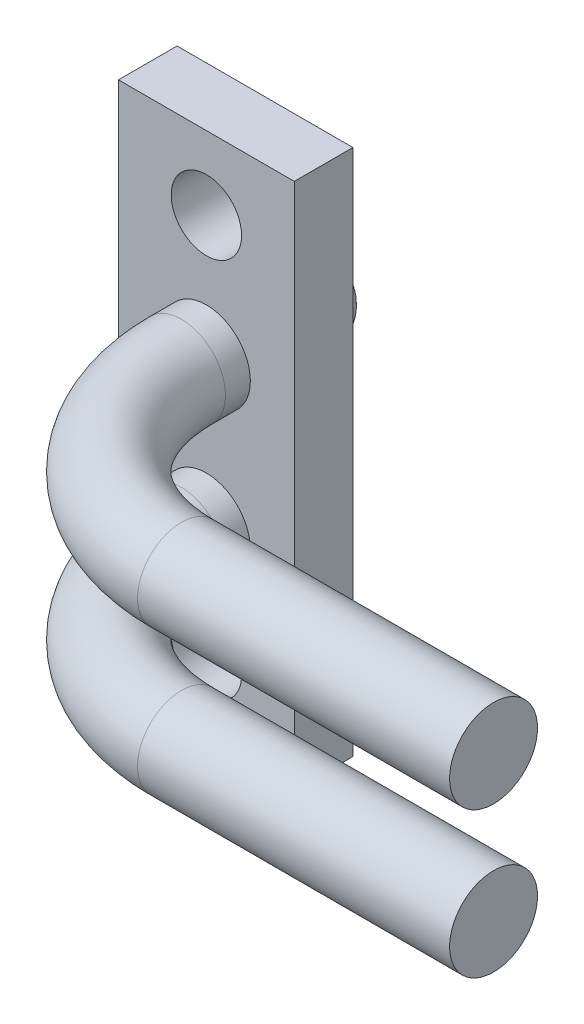
ISO-10303-21;
HEADER;
FILE_DESCRIPTION(('STEP AP214'),'2;1');
FILE_NAME('part.step','',(''),(''),'','','');
FILE_SCHEMA(('AUTOMOTIVE_DESIGN { 1 0 10303 214 1 1 1 1 }'));
ENDSEC;
DATA;
#1=APPLICATION_CONTEXT('core data for automotive mechanical design processes');
#2=APPLICATION_PROTOCOL_DEFINITION('international standard','automotive_design',2000,#1);
#3=PRODUCT_CONTEXT('',#1,'mechanical');
#4=PRODUCT('Part','Part','',(#3));
#5=PRODUCT_RELATED_PRODUCT_CATEGORY('part','',(#4));
#6=PRODUCT_DEFINITION_FORMATION('','',#4);
#7=PRODUCT_DEFINITION_CONTEXT('part definition',#1,'design');
#8=PRODUCT_DEFINITION('design','',#6,#7);
#9=PRODUCT_DEFINITION_SHAPE('','',#8);
#10=(LENGTH_UNIT() NAMED_UNIT(*) SI_UNIT(.MILLI.,.METRE.));
#11=(NAMED_UNIT(*) PLANE_ANGLE_UNIT() SI_UNIT($,.RADIAN.));
#12=(NAMED_UNIT(*) SI_UNIT($,.STERADIAN.) SOLID_ANGLE_UNIT());
#13=UNCERTAINTY_MEASURE_WITH_UNIT(LENGTH_MEASURE(1.E-05),#10,'distance_accuracy_value','');
#14=(GEOMETRIC_REPRESENTATION_CONTEXT(3) GLOBAL_UNCERTAINTY_ASSIGNED_CONTEXT((#13)) GLOBAL_UNIT_ASSIGNED_CONTEXT((#10,
#11,#12)) REPRESENTATION_CONTEXT('',''));
#15=CARTESIAN_POINT('',(0.,0.,0.));
#16=DIRECTION('',(0.,0.,1.));
#17=DIRECTION('',(1.,0.,0.));
#18=AXIS2_PLACEMENT_3D('',#15,#16,#17);
#19=CARTESIAN_POINT('',(3.,9.,2.));
#20=DIRECTION('',(0.,0.,-1.));
#21=DIRECTION('',(-1.,0.,0.));
#22=AXIS2_PLACEMENT_3D('',#19,#20,#21);
#23=PLANE('',#22);
#24=CARTESIAN_POINT('',(0.,-6.5,2.));
#25=DIRECTION('',(0.,0.,1.));
#26=DIRECTION('',(-1.,0.,0.));
#27=AXIS2_PLACEMENT_3D('',#24,#25,#26);
#28=CIRCLE('',#27,1.2);
#29=CARTESIAN_POINT('',(-1.19999999999999,-6.5,2.));
#30=VERTEX_POINT('',#29);
#31=EDGE_CURVE('E130',#30,#30,#28,.T.);
#32=ORIENTED_EDGE('',*,*,#31,.F.);
#33=EDGE_LOOP('',(#32));
#34=FACE_BOUND('',#33,.T.);
#35=CARTESIAN_POINT('',(0.,6.5,2.));
#36=DIRECTION('',(0.,0.,1.));
#37=DIRECTION('',(1.,0.,0.));
#38=AXIS2_PLACEMENT_3D('',#35,#36,#37);
#39=CIRCLE('',#38,1.2);
#40=CARTESIAN_POINT('',(1.2,6.5,2.));
#41=VERTEX_POINT('',#40);
#42=EDGE_CURVE('E119',#41,#41,#39,.T.);
#43=ORIENTED_EDGE('',*,*,#42,.F.);
#44=EDGE_LOOP('',(#43));
#45=FACE_BOUND('',#44,.T.);
#46=CARTESIAN_POINT('',(0.,-2.62,2.));
#47=DIRECTION('',(0.,0.,1.));
#48=DIRECTION('',(1.,0.,0.));
#49=AXIS2_PLACEMENT_3D('',#46,#47,#48);
#50=CIRCLE('',#49,1.5);
#51=CARTESIAN_POINT('',(1.5,-2.62,2.));
#52=VERTEX_POINT('',#51);
#53=EDGE_CURVE('E41',#52,#52,#50,.T.);
#54=ORIENTED_EDGE('',*,*,#53,.F.);
#55=EDGE_LOOP('',(#54));
#56=FACE_BOUND('',#55,.T.);
#57=DIRECTION('',(0.,1.,0.));
#58=VECTOR('',#57,1.);
#59=CARTESIAN_POINT('',(3.,-9.,2.));
#60=LINE('',#59,#58);
#61=CARTESIAN_POINT('',(3.,-9.,2.));
#62=VERTEX_POINT('',#61);
#63=CARTESIAN_POINT('',(3.,9.,2.));
#64=VERTEX_POINT('',#63);
#65=EDGE_CURVE('E86',#62,#64,#60,.T.);
#66=ORIENTED_EDGE('',*,*,#65,.T.);
#67=DIRECTION('',(-1.,0.,0.));
#68=VECTOR('',#67,1.);
#69=CARTESIAN_POINT('',(-3.,9.,2.));
#70=LINE('',#69,#68);
#71=CARTESIAN_POINT('',(-3.,9.,2.));
#72=VERTEX_POINT('',#71);
#73=EDGE_CURVE('E81',#64,#72,#70,.T.);
#74=ORIENTED_EDGE('',*,*,#73,.T.);
#75=DIRECTION('',(0.,-1.,0.));
#76=VECTOR('',#75,1.);
#77=CARTESIAN_POINT('',(-3.,-9.,2.));
#78=LINE('',#77,#76);
#79=CARTESIAN_POINT('',(-3.,-9.,2.));
#80=VERTEX_POINT('',#79);
#81=EDGE_CURVE('E84',#72,#80,#78,.T.);
#82=ORIENTED_EDGE('',*,*,#81,.T.);
#83=DIRECTION('',(1.,0.,0.));
#84=VECTOR('',#83,1.);
#85=CARTESIAN_POINT('',(-3.,-9.,2.));
#86=LINE('',#85,#84);
#87=EDGE_CURVE('E50',#80,#62,#86,.T.);
#88=ORIENTED_EDGE('',*,*,#87,.T.);
#89=EDGE_LOOP('',(#66,#74,#82,#88));
#90=FACE_BOUND('',#89,.T.);
#91=CARTESIAN_POINT('',(0.,2.35,2.));
#92=DIRECTION('',(0.,0.,1.));
#93=DIRECTION('',(1.,0.,0.));
#94=AXIS2_PLACEMENT_3D('',#91,#92,#93);
#95=CIRCLE('',#94,1.5);
#96=CARTESIAN_POINT('',(1.5,2.35,2.));
#97=VERTEX_POINT('',#96);
#98=EDGE_CURVE('E11',#97,#97,#95,.T.);
#99=ORIENTED_EDGE('',*,*,#98,.F.);
#100=EDGE_LOOP('',(#99));
#101=FACE_BOUND('',#100,.T.);
#102=ADVANCED_FACE('F31',(#34,#45,#56,#90,#101),#23,.F.);
#103=CARTESIAN_POINT('',(3.,9.,0.));
#104=DIRECTION('',(0.,0.,-1.));
#105=DIRECTION('',(-1.,0.,0.));
#106=AXIS2_PLACEMENT_3D('',#103,#104,#105);
#107=PLANE('',#106);
#108=CARTESIAN_POINT('',(0.,-6.5,0.));
#109=DIRECTION('',(0.,0.,-1.));
#110=DIRECTION('',(-1.,0.,0.));
#111=AXIS2_PLACEMENT_3D('',#108,#109,#110);
#112=CIRCLE('',#111,1.2);
#113=CARTESIAN_POINT('',(-1.19999999999999,-6.5,0.));
#114=VERTEX_POINT('',#113);
#115=EDGE_CURVE('E35',#114,#114,#112,.T.);
#116=ORIENTED_EDGE('',*,*,#115,.F.);
#117=EDGE_LOOP('',(#116));
#118=FACE_BOUND('',#117,.T.);
#119=CARTESIAN_POINT('',(0.,6.5,0.));
#120=DIRECTION('',(0.,0.,-1.));
#121=DIRECTION('',(-1.,0.,0.));
#122=AXIS2_PLACEMENT_3D('',#119,#120,#121);
#123=CIRCLE('',#122,1.2);
#124=CARTESIAN_POINT('',(-1.2,6.5,0.));
#125=VERTEX_POINT('',#124);
#126=EDGE_CURVE('E116',#125,#125,#123,.T.);
#127=ORIENTED_EDGE('',*,*,#126,.F.);
#128=EDGE_LOOP('',(#127));
#129=FACE_BOUND('',#128,.T.);
#130=CARTESIAN_POINT('',(0.,2.35,0.));
#131=DIRECTION('',(0.,0.,-1.));
#132=DIRECTION('',(-1.,0.,0.));
#133=AXIS2_PLACEMENT_3D('',#130,#131,#132);
#134=CIRCLE('',#133,1.5);
#135=CARTESIAN_POINT('',(-1.5,2.35,0.));
#136=VERTEX_POINT('',#135);
#137=EDGE_CURVE('E104',#136,#136,#134,.T.);
#138=ORIENTED_EDGE('',*,*,#137,.F.);
#139=EDGE_LOOP('',(#138));
#140=FACE_BOUND('',#139,.T.);
#141=DIRECTION('',(0.,1.,0.));
#142=VECTOR('',#141,1.);
#143=CARTESIAN_POINT('',(3.,-9.,0.));
#144=LINE('',#143,#142);
#145=CARTESIAN_POINT('',(3.,-9.,0.));
#146=VERTEX_POINT('',#145);
#147=CARTESIAN_POINT('',(3.,9.,0.));
#148=VERTEX_POINT('',#147);
#149=EDGE_CURVE('E101',#146,#148,#144,.T.);
#150=ORIENTED_EDGE('',*,*,#149,.F.);
#151=DIRECTION('',(1.,0.,0.));
#152=VECTOR('',#151,1.);
#153=CARTESIAN_POINT('',(-3.,-9.,0.));
#154=LINE('',#153,#152);
#155=CARTESIAN_POINT('',(-3.,-9.,0.));
#156=VERTEX_POINT('',#155);
#157=EDGE_CURVE('E73',#156,#146,#154,.T.);
#158=ORIENTED_EDGE('',*,*,#157,.F.);
#159=DIRECTION('',(0.,-1.,0.));
#160=VECTOR('',#159,1.);
#161=CARTESIAN_POINT('',(-3.,-9.,0.));
#162=LINE('',#161,#160);
#163=CARTESIAN_POINT('',(-3.,9.,0.));
#164=VERTEX_POINT('',#163);
#165=EDGE_CURVE('E67',#164,#156,#162,.T.);
#166=ORIENTED_EDGE('',*,*,#165,.F.);
#167=DIRECTION('',(-1.,0.,0.));
#168=VECTOR('',#167,1.);
#169=CARTESIAN_POINT('',(-3.,9.,0.));
#170=LINE('',#169,#168);
#171=EDGE_CURVE('E91',#148,#164,#170,.T.);
#172=ORIENTED_EDGE('',*,*,#171,.F.);
#173=EDGE_LOOP('',(#150,#158,#166,#172));
#174=FACE_BOUND('',#173,.T.);
#175=CARTESIAN_POINT('',(0.,-2.62,0.));
#176=DIRECTION('',(0.,0.,-1.));
#177=DIRECTION('',(-1.,0.,0.));
#178=AXIS2_PLACEMENT_3D('',#175,#176,#177);
#179=CIRCLE('',#178,1.5);
#180=CARTESIAN_POINT('',(-1.5,-2.62,0.));
#181=VERTEX_POINT('',#180);
#182=EDGE_CURVE('E149',#181,#181,#179,.T.);
#183=ORIENTED_EDGE('',*,*,#182,.F.);
#184=EDGE_LOOP('',(#183));
#185=FACE_BOUND('',#184,.T.);
#186=ADVANCED_FACE('F157',(#118,#129,#140,#174,#185),#107,.T.);
#187=CARTESIAN_POINT('',(3.,-9.,2.));
#188=DIRECTION('',(-1.,0.,0.));
#189=DIRECTION('',(0.,0.,1.));
#190=AXIS2_PLACEMENT_3D('',#187,#188,#189);
#191=PLANE('',#190);
#192=ORIENTED_EDGE('',*,*,#149,.T.);
#193=DIRECTION('',(0.,0.,-1.));
#194=VECTOR('',#193,1.);
#195=CARTESIAN_POINT('',(3.,9.,2.));
#196=LINE('',#195,#194);
#197=EDGE_CURVE('E92',#64,#148,#196,.T.);
#198=ORIENTED_EDGE('',*,*,#197,.F.);
#199=ORIENTED_EDGE('',*,*,#65,.F.);
#200=DIRECTION('',(0.,0.,-1.));
#201=VECTOR('',#200,1.);
#202=CARTESIAN_POINT('',(3.,-9.,2.));
#203=LINE('',#202,#201);
#204=EDGE_CURVE('E97',#62,#146,#203,.T.);
#205=ORIENTED_EDGE('',*,*,#204,.T.);
#206=EDGE_LOOP('',(#192,#198,#199,#205));
#207=FACE_BOUND('',#206,.T.);
#208=ADVANCED_FACE('F160',(#207),#191,.F.);
#209=CARTESIAN_POINT('',(-3.,9.,2.));
#210=DIRECTION('',(0.,-1.,0.));
#211=DIRECTION('',(0.,0.,-1.));
#212=AXIS2_PLACEMENT_3D('',#209,#210,#211);
#213=PLANE('',#212);
#214=ORIENTED_EDGE('',*,*,#171,.T.);
#215=DIRECTION('',(0.,0.,-1.));
#216=VECTOR('',#215,1.);
#217=CARTESIAN_POINT('',(-3.,9.,2.));
#218=LINE('',#217,#216);
#219=EDGE_CURVE('E89',#72,#164,#218,.T.);
#220=ORIENTED_EDGE('',*,*,#219,.F.);
#221=ORIENTED_EDGE('',*,*,#73,.F.);
#222=ORIENTED_EDGE('',*,*,#197,.T.);
#223=EDGE_LOOP('',(#214,#220,#221,#222));
#224=FACE_BOUND('',#223,.T.);
#225=ADVANCED_FACE('F90',(#224),#213,.F.);
#226=CARTESIAN_POINT('',(-3.,-9.,2.));
#227=DIRECTION('',(1.,0.,0.));
#228=DIRECTION('',(0.,0.,-1.));
#229=AXIS2_PLACEMENT_3D('',#226,#227,#228);
#230=PLANE('',#229);
#231=ORIENTED_EDGE('',*,*,#165,.T.);
#232=DIRECTION('',(0.,0.,-1.));
#233=VECTOR('',#232,1.);
#234=CARTESIAN_POINT('',(-3.,-9.,2.));
#235=LINE('',#234,#233);
#236=EDGE_CURVE('E93',#80,#156,#235,.T.);
#237=ORIENTED_EDGE('',*,*,#236,.F.);
#238=ORIENTED_EDGE('',*,*,#81,.F.);
#239=ORIENTED_EDGE('',*,*,#219,.T.);
#240=EDGE_LOOP('',(#231,#237,#238,#239));
#241=FACE_BOUND('',#240,.T.);
#242=ADVANCED_FACE('F95',(#241),#230,.F.);
#243=CARTESIAN_POINT('',(-3.,-9.,2.));
#244=DIRECTION('',(0.,1.,0.));
#245=DIRECTION('',(0.,0.,1.));
#246=AXIS2_PLACEMENT_3D('',#243,#244,#245);
#247=PLANE('',#246);
#248=ORIENTED_EDGE('',*,*,#157,.T.);
#249=ORIENTED_EDGE('',*,*,#204,.F.);
#250=ORIENTED_EDGE('',*,*,#87,.F.);
#251=ORIENTED_EDGE('',*,*,#236,.T.);
#252=EDGE_LOOP('',(#248,#249,#250,#251));
#253=FACE_BOUND('',#252,.T.);
#254=ADVANCED_FACE('F177',(#253),#247,.F.);
#255=CARTESIAN_POINT('',(0.,2.35,-2.5));
#256=DIRECTION('',(0.,0.,1.));
#257=DIRECTION('',(1.,0.,0.));
#258=AXIS2_PLACEMENT_3D('',#255,#256,#257);
#259=CYLINDRICAL_SURFACE('',#258,1.5);
#260=CARTESIAN_POINT('',(0.,2.35,-1.));
#261=DIRECTION('',(0.,0.,1.));
#262=DIRECTION('',(1.,0.,0.));
#263=AXIS2_PLACEMENT_3D('',#260,#261,#262);
#264=CIRCLE('',#263,1.5);
#265=CARTESIAN_POINT('',(1.5,2.35,-1.));
#266=VERTEX_POINT('',#265);
#267=EDGE_CURVE('E114',#266,#266,#264,.T.);
#268=ORIENTED_EDGE('',*,*,#267,.T.);
#269=EDGE_LOOP('',(#268));
#270=FACE_BOUND('',#269,.T.);
#271=ORIENTED_EDGE('',*,*,#137,.T.);
#272=EDGE_LOOP('',(#271));
#273=FACE_BOUND('',#272,.T.);
#274=ADVANCED_FACE('F155',(#270,#273),#259,.T.);
#275=CARTESIAN_POINT('',(0.,-2.62,-2.5));
#276=DIRECTION('',(0.,0.,1.));
#277=DIRECTION('',(1.,0.,0.));
#278=AXIS2_PLACEMENT_3D('',#275,#276,#277);
#279=CYLINDRICAL_SURFACE('',#278,1.5);
#280=CARTESIAN_POINT('',(0.,-2.62,-0.6));
#281=DIRECTION('',(0.,0.,1.));
#282=DIRECTION('',(1.,0.,0.));
#283=AXIS2_PLACEMENT_3D('',#280,#281,#282);
#284=CIRCLE('',#283,1.5);
#285=CARTESIAN_POINT('',(1.5,-2.62,-0.6));
#286=VERTEX_POINT('',#285);
#287=EDGE_CURVE('E111',#286,#286,#284,.T.);
#288=ORIENTED_EDGE('',*,*,#287,.T.);
#289=EDGE_LOOP('',(#288));
#290=FACE_BOUND('',#289,.T.);
#291=ORIENTED_EDGE('',*,*,#182,.T.);
#292=EDGE_LOOP('',(#291));
#293=FACE_BOUND('',#292,.T.);
#294=ADVANCED_FACE('F167',(#290,#293),#279,.T.);
#295=CARTESIAN_POINT('',(0.,-2.62,-0.6));
#296=DIRECTION('',(0.,0.,1.));
#297=DIRECTION('',(1.,0.,0.));
#298=AXIS2_PLACEMENT_3D('',#295,#296,#297);
#299=SPHERICAL_SURFACE('',#298,1.5);
#300=ORIENTED_EDGE('',*,*,#287,.F.);
#301=EDGE_LOOP('',(#300));
#302=FACE_BOUND('',#301,.T.);
#303=ADVANCED_FACE('F169',(#302),#299,.T.);
#304=CARTESIAN_POINT('',(0.,2.35,-1.));
#305=DIRECTION('',(0.,0.,1.));
#306=DIRECTION('',(1.,0.,0.));
#307=AXIS2_PLACEMENT_3D('',#304,#305,#306);
#308=SPHERICAL_SURFACE('',#307,1.5);
#309=ORIENTED_EDGE('',*,*,#267,.F.);
#310=EDGE_LOOP('',(#309));
#311=FACE_BOUND('',#310,.T.);
#312=ADVANCED_FACE('F33',(#311),#308,.T.);
#313=CARTESIAN_POINT('',(6.,-2.62,8.85));
#314=DIRECTION('',(1.,0.,0.));
#315=DIRECTION('',(0.,0.,-1.));
#316=AXIS2_PLACEMENT_3D('',#313,#314,#315);
#317=CYLINDRICAL_SURFACE('',#316,1.5);
#318=CARTESIAN_POINT('',(6.,-2.62,8.85));
#319=DIRECTION('',(1.,0.,0.));
#320=DIRECTION('',(0.,0.,-1.));
#321=AXIS2_PLACEMENT_3D('',#318,#319,#320);
#322=CIRCLE('',#321,1.5);
#323=CARTESIAN_POINT('',(6.,-2.62,10.35));
#324=VERTEX_POINT('',#323);
#325=EDGE_CURVE('E141',#324,#324,#322,.T.);
#326=ORIENTED_EDGE('',*,*,#325,.T.);
#327=EDGE_LOOP('',(#326));
#328=FACE_BOUND('',#327,.T.);
#329=CARTESIAN_POINT('',(16.65,-2.62,8.85));
#330=DIRECTION('',(1.,0.,0.));
#331=DIRECTION('',(0.,0.,-1.));
#332=AXIS2_PLACEMENT_3D('',#329,#330,#331);
#333=CIRCLE('',#332,1.5);
#334=CARTESIAN_POINT('',(16.65,-2.62,7.35));
#335=VERTEX_POINT('',#334);
#336=EDGE_CURVE('E146',#335,#335,#333,.T.);
#337=ORIENTED_EDGE('',*,*,#336,.F.);
#338=EDGE_LOOP('',(#337));
#339=FACE_BOUND('',#338,.T.);
#340=ADVANCED_FACE('F237',(#328,#339),#317,.T.);
#341=CARTESIAN_POINT('',(6.,-2.62,2.85));
#342=DIRECTION('',(0.,1.,0.));
#343=DIRECTION('',(0.,0.,1.));
#344=AXIS2_PLACEMENT_3D('',#341,#342,#343);
#345=TOROIDAL_SURFACE('',#344,6.,1.5);
#346=CARTESIAN_POINT('',(0.,-2.62,2.85));
#347=DIRECTION('',(0.,0.,1.));
#348=DIRECTION('',(1.,0.,0.));
#349=AXIS2_PLACEMENT_3D('',#346,#347,#348);
#350=CIRCLE('',#349,1.5);
#351=CARTESIAN_POINT('',(-1.5,-2.62,2.85));
#352=VERTEX_POINT('',#351);
#353=EDGE_CURVE('E138',#352,#352,#350,.T.);
#354=CARTESIAN_POINT('',(6.,-2.62,2.85));
#355=DIRECTION('',(0.,1.,0.));
#356=DIRECTION('',(0.,0.,1.));
#357=AXIS2_PLACEMENT_3D('',#354,#355,#356);
#358=CIRCLE('',#357,7.5);
#359=EDGE_CURVE('',#352,#324,#358,.T.);
#360=ORIENTED_EDGE('',*,*,#353,.T.);
#361=ORIENTED_EDGE('',*,*,#325,.F.);
#362=ORIENTED_EDGE('',*,*,#359,.T.);
#363=ORIENTED_EDGE('',*,*,#359,.F.);
#364=EDGE_LOOP('',(#360,#362,#361,#363));
#365=FACE_BOUND('',#364,.T.);
#366=ADVANCED_FACE('F247',(#365),#345,.T.);
#367=CARTESIAN_POINT('',(0.,-2.62,2.85));
#368=DIRECTION('',(0.,0.,-1.));
#369=DIRECTION('',(-1.,0.,0.));
#370=AXIS2_PLACEMENT_3D('',#367,#368,#369);
#371=CYLINDRICAL_SURFACE('',#370,1.5);
#372=ORIENTED_EDGE('',*,*,#353,.F.);
#373=EDGE_LOOP('',(#372));
#374=FACE_BOUND('',#373,.T.);
#375=ORIENTED_EDGE('',*,*,#53,.T.);
#376=EDGE_LOOP('',(#375));
#377=FACE_BOUND('',#376,.T.);
#378=ADVANCED_FACE('F256',(#374,#377),#371,.T.);
#379=CARTESIAN_POINT('',(16.65,-2.62,8.85));
#380=DIRECTION('',(1.,0.,0.));
#381=DIRECTION('',(0.,0.,-1.));
#382=AXIS2_PLACEMENT_3D('',#379,#380,#381);
#383=PLANE('',#382);
#384=ORIENTED_EDGE('',*,*,#336,.T.);
#385=EDGE_LOOP('',(#384));
#386=FACE_BOUND('',#385,.T.);
#387=ADVANCED_FACE('F266',(#386),#383,.T.);
#388=CARTESIAN_POINT('',(6.,2.35,8.85));
#389=DIRECTION('',(1.,0.,0.));
#390=DIRECTION('',(0.,0.,-1.));
#391=AXIS2_PLACEMENT_3D('',#388,#389,#390);
#392=CYLINDRICAL_SURFACE('',#391,1.5);
#393=CARTESIAN_POINT('',(6.,2.35,8.85));
#394=DIRECTION('',(1.,0.,0.));
#395=DIRECTION('',(0.,0.,-1.));
#396=AXIS2_PLACEMENT_3D('',#393,#394,#395);
#397=CIRCLE('',#396,1.5);
#398=CARTESIAN_POINT('',(6.,2.35,10.35));
#399=VERTEX_POINT('',#398);
#400=EDGE_CURVE('E123',#399,#399,#397,.T.);
#401=ORIENTED_EDGE('',*,*,#400,.T.);
#402=EDGE_LOOP('',(#401));
#403=FACE_BOUND('',#402,.T.);
#404=CARTESIAN_POINT('',(16.65,2.35,8.85));
#405=DIRECTION('',(1.,0.,0.));
#406=DIRECTION('',(0.,0.,-1.));
#407=AXIS2_PLACEMENT_3D('',#404,#405,#406);
#408=CIRCLE('',#407,1.5);
#409=CARTESIAN_POINT('',(16.65,2.35,7.35));
#410=VERTEX_POINT('',#409);
#411=EDGE_CURVE('E135',#410,#410,#408,.T.);
#412=ORIENTED_EDGE('',*,*,#411,.F.);
#413=EDGE_LOOP('',(#412));
#414=FACE_BOUND('',#413,.T.);
#415=ADVANCED_FACE('F276',(#403,#414),#392,.T.);
#416=CARTESIAN_POINT('',(6.,2.35,2.85));
#417=DIRECTION('',(0.,1.,0.));
#418=DIRECTION('',(0.,0.,1.));
#419=AXIS2_PLACEMENT_3D('',#416,#417,#418);
#420=TOROIDAL_SURFACE('',#419,6.,1.5);
#421=CARTESIAN_POINT('',(0.,2.35,2.85));
#422=DIRECTION('',(0.,0.,1.));
#423=DIRECTION('',(1.,0.,0.));
#424=AXIS2_PLACEMENT_3D('',#421,#422,#423);
#425=CIRCLE('',#424,1.5);
#426=CARTESIAN_POINT('',(-1.5,2.35,2.85));
#427=VERTEX_POINT('',#426);
#428=EDGE_CURVE('E118',#427,#427,#425,.T.);
#429=CARTESIAN_POINT('',(6.,2.35,2.85));
#430=DIRECTION('',(0.,1.,0.));
#431=DIRECTION('',(0.,0.,1.));
#432=AXIS2_PLACEMENT_3D('',#429,#430,#431);
#433=CIRCLE('',#432,7.5);
#434=EDGE_CURVE('',#427,#399,#433,.T.);
#435=ORIENTED_EDGE('',*,*,#428,.T.);
#436=ORIENTED_EDGE('',*,*,#400,.F.);
#437=ORIENTED_EDGE('',*,*,#434,.T.);
#438=ORIENTED_EDGE('',*,*,#434,.F.);
#439=EDGE_LOOP('',(#435,#437,#436,#438));
#440=FACE_BOUND('',#439,.T.);
#441=ADVANCED_FACE('F286',(#440),#420,.T.);
#442=CARTESIAN_POINT('',(0.,2.35,2.85));
#443=DIRECTION('',(0.,0.,-1.));
#444=DIRECTION('',(-1.,0.,0.));
#445=AXIS2_PLACEMENT_3D('',#442,#443,#444);
#446=CYLINDRICAL_SURFACE('',#445,1.5);
#447=ORIENTED_EDGE('',*,*,#428,.F.);
#448=EDGE_LOOP('',(#447));
#449=FACE_BOUND('',#448,.T.);
#450=ORIENTED_EDGE('',*,*,#98,.T.);
#451=EDGE_LOOP('',(#450));
#452=FACE_BOUND('',#451,.T.);
#453=ADVANCED_FACE('F296',(#449,#452),#446,.T.);
#454=CARTESIAN_POINT('',(16.65,2.35,8.85));
#455=DIRECTION('',(1.,0.,0.));
#456=DIRECTION('',(0.,0.,-1.));
#457=AXIS2_PLACEMENT_3D('',#454,#455,#456);
#458=PLANE('',#457);
#459=ORIENTED_EDGE('',*,*,#411,.T.);
#460=EDGE_LOOP('',(#459));
#461=FACE_BOUND('',#460,.T.);
#462=ADVANCED_FACE('F306',(#461),#458,.T.);
#463=CARTESIAN_POINT('',(0.,6.5,-2.5));
#464=DIRECTION('',(0.,0.,1.));
#465=DIRECTION('',(1.,0.,0.));
#466=AXIS2_PLACEMENT_3D('',#463,#464,#465);
#467=CYLINDRICAL_SURFACE('',#466,1.2);
#468=ORIENTED_EDGE('',*,*,#126,.T.);
#469=EDGE_LOOP('',(#468));
#470=FACE_BOUND('',#469,.T.);
#471=ORIENTED_EDGE('',*,*,#42,.T.);
#472=EDGE_LOOP('',(#471));
#473=FACE_BOUND('',#472,.T.);
#474=ADVANCED_FACE('F315',(#470,#473),#467,.F.);
#475=CARTESIAN_POINT('',(0.,-6.5,-2.5));
#476=DIRECTION('',(0.,0.,1.));
#477=DIRECTION('',(1.,0.,0.));
#478=AXIS2_PLACEMENT_3D('',#475,#476,#477);
#479=CYLINDRICAL_SURFACE('',#478,1.2);
#480=ORIENTED_EDGE('',*,*,#115,.T.);
#481=EDGE_LOOP('',(#480));
#482=FACE_BOUND('',#481,.T.);
#483=ORIENTED_EDGE('',*,*,#31,.T.);
#484=EDGE_LOOP('',(#483));
#485=FACE_BOUND('',#484,.T.);
#486=ADVANCED_FACE('F332',(#482,#485),#479,.F.);
#487=CLOSED_SHELL('',(#102,#186,#208,#225,#242,#254,#274,#294,#303,#312,#340,#366,#378,#387,
#415,#441,#453,#462,#474,#486));
#488=MANIFOLD_SOLID_BREP('B2',#487);
#489=ADVANCED_BREP_SHAPE_REPRESENTATION('',(#18,#488),#14);
#490=SHAPE_DEFINITION_REPRESENTATION(#9,#489);
ENDSEC;
END-ISO-10303-21;
